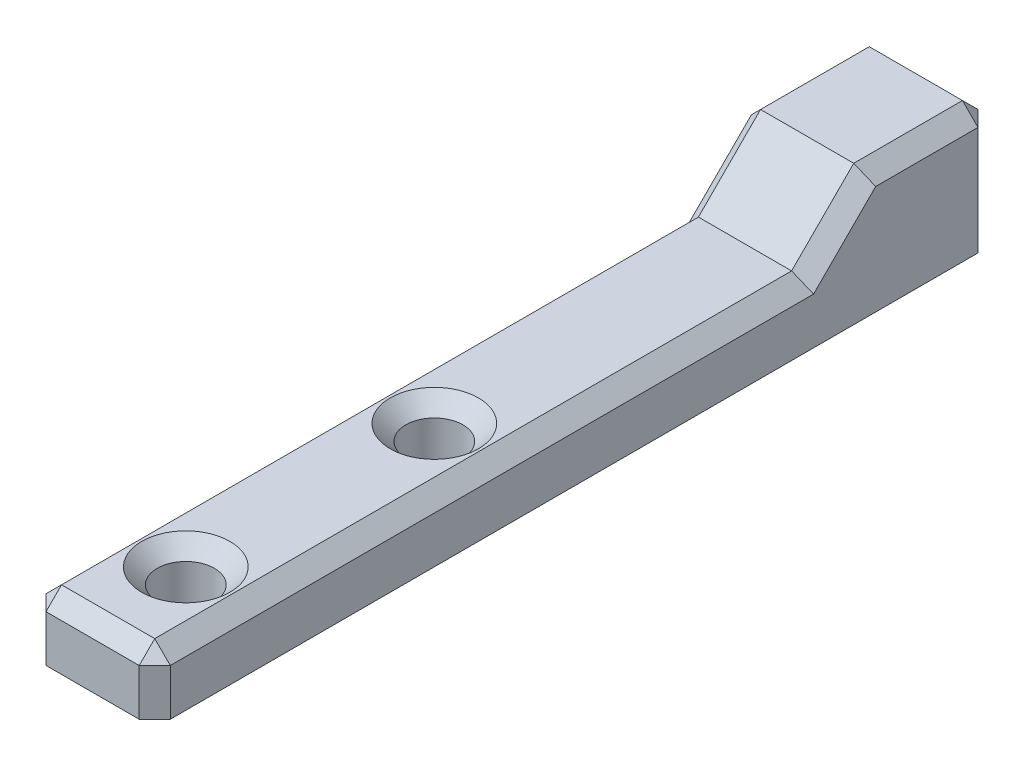
ISO-10303-21;
HEADER;
FILE_DESCRIPTION(('STEP AP214'),'2;1');
FILE_NAME('part.step','',(''),(''),'','','');
FILE_SCHEMA(('AUTOMOTIVE_DESIGN { 1 0 10303 214 1 1 1 1 }'));
ENDSEC;
DATA;
#1=APPLICATION_CONTEXT('core data for automotive mechanical design processes');
#2=APPLICATION_PROTOCOL_DEFINITION('international standard','automotive_design',2000,#1);
#3=PRODUCT_CONTEXT('',#1,'mechanical');
#4=PRODUCT('Part','Part','',(#3));
#5=PRODUCT_RELATED_PRODUCT_CATEGORY('part','',(#4));
#6=PRODUCT_DEFINITION_FORMATION('','',#4);
#7=PRODUCT_DEFINITION_CONTEXT('part definition',#1,'design');
#8=PRODUCT_DEFINITION('design','',#6,#7);
#9=PRODUCT_DEFINITION_SHAPE('','',#8);
#10=(LENGTH_UNIT() NAMED_UNIT(*) SI_UNIT(.MILLI.,.METRE.));
#11=(NAMED_UNIT(*) PLANE_ANGLE_UNIT() SI_UNIT($,.RADIAN.));
#12=(NAMED_UNIT(*) SI_UNIT($,.STERADIAN.) SOLID_ANGLE_UNIT());
#13=UNCERTAINTY_MEASURE_WITH_UNIT(LENGTH_MEASURE(1.E-05),#10,'distance_accuracy_value','');
#14=(GEOMETRIC_REPRESENTATION_CONTEXT(3) GLOBAL_UNCERTAINTY_ASSIGNED_CONTEXT((#13)) GLOBAL_UNIT_ASSIGNED_CONTEXT((#10,
#11,#12)) REPRESENTATION_CONTEXT('',''));
#15=CARTESIAN_POINT('',(0.,0.,0.));
#16=DIRECTION('',(0.,0.,1.));
#17=DIRECTION('',(1.,0.,0.));
#18=AXIS2_PLACEMENT_3D('',#15,#16,#17);
#19=CARTESIAN_POINT('',(0.,12.7,0.));
#20=DIRECTION('',(0.,-1.,0.));
#21=DIRECTION('',(0.,0.,-1.));
#22=AXIS2_PLACEMENT_3D('',#19,#20,#21);
#23=PLANE('',#22);
#24=DIRECTION('',(-1.,0.,0.));
#25=VECTOR('',#24,1.);
#26=CARTESIAN_POINT('',(0.,12.7,-84.1375));
#27=LINE('',#26,#25);
#28=CARTESIAN_POINT('',(11.1125,12.7,-84.1375));
#29=VERTEX_POINT('',#28);
#30=CARTESIAN_POINT('',(1.58750000000001,12.7,-84.1375));
#31=VERTEX_POINT('',#30);
#32=EDGE_CURVE('E251',#29,#31,#27,.T.);
#33=ORIENTED_EDGE('',*,*,#32,.T.);
#34=DIRECTION('',(0.,0.,1.));
#35=VECTOR('',#34,1.);
#36=CARTESIAN_POINT('',(1.58750000000001,12.7,0.));
#37=LINE('',#36,#35);
#38=CARTESIAN_POINT('',(1.58750000000001,12.7,-73.025));
#39=VERTEX_POINT('',#38);
#40=EDGE_CURVE('E254',#31,#39,#37,.T.);
#41=ORIENTED_EDGE('',*,*,#40,.T.);
#42=DIRECTION('',(1.,0.,0.));
#43=VECTOR('',#42,1.);
#44=CARTESIAN_POINT('',(0.,12.7,-73.025));
#45=LINE('',#44,#43);
#46=CARTESIAN_POINT('',(11.1125,12.7,-73.025));
#47=VERTEX_POINT('',#46);
#48=EDGE_CURVE('E338',#39,#47,#45,.T.);
#49=ORIENTED_EDGE('',*,*,#48,.T.);
#50=DIRECTION('',(0.,0.,-1.));
#51=VECTOR('',#50,1.);
#52=CARTESIAN_POINT('',(11.1125,12.7,0.));
#53=LINE('',#52,#51);
#54=EDGE_CURVE('E248',#47,#29,#53,.T.);
#55=ORIENTED_EDGE('',*,*,#54,.T.);
#56=EDGE_LOOP('',(#33,#41,#49,#55));
#57=FACE_BOUND('',#56,.T.);
#58=ADVANCED_FACE('F41',(#57),#23,.F.);
#59=CARTESIAN_POINT('',(0.,0.,0.));
#60=DIRECTION('',(0.,-1.,0.));
#61=DIRECTION('',(0.,0.,-1.));
#62=AXIS2_PLACEMENT_3D('',#59,#60,#61);
#63=PLANE('',#62);
#64=CARTESIAN_POINT('',(6.35,0.,-9.525));
#65=DIRECTION('',(0.,1.,0.));
#66=DIRECTION('',(0.,0.,1.));
#67=AXIS2_PLACEMENT_3D('',#64,#65,#66);
#68=CIRCLE('',#67,2.921);
#69=CARTESIAN_POINT('',(6.35,0.,-6.604));
#70=VERTEX_POINT('',#69);
#71=EDGE_CURVE('E183',#70,#70,#68,.T.);
#72=ORIENTED_EDGE('',*,*,#71,.T.);
#73=EDGE_LOOP('',(#72));
#74=FACE_BOUND('',#73,.T.);
#75=DIRECTION('',(1.,0.,0.));
#76=VECTOR('',#75,1.);
#77=CARTESIAN_POINT('',(0.,0.,0.));
#78=LINE('',#77,#76);
#79=CARTESIAN_POINT('',(1.58750000000001,0.,0.));
#80=VERTEX_POINT('',#79);
#81=CARTESIAN_POINT('',(11.1125,0.,0.));
#82=VERTEX_POINT('',#81);
#83=EDGE_CURVE('E161',#80,#82,#78,.T.);
#84=ORIENTED_EDGE('',*,*,#83,.F.);
#85=DIRECTION('',(0.707106781186548,0.,0.707106781186548));
#86=VECTOR('',#85,1.);
#87=CARTESIAN_POINT('',(0.793750000000003,0.,-0.793750000000003));
#88=LINE('',#87,#86);
#89=CARTESIAN_POINT('',(0.,0.,-1.58750000000001));
#90=VERTEX_POINT('',#89);
#91=EDGE_CURVE('E144',#80,#90,#88,.F.);
#92=ORIENTED_EDGE('',*,*,#91,.T.);
#93=DIRECTION('',(0.,0.,1.));
#94=VECTOR('',#93,1.);
#95=CARTESIAN_POINT('',(0.,0.,0.));
#96=LINE('',#95,#94);
#97=CARTESIAN_POINT('',(0.,0.,-84.1375));
#98=VERTEX_POINT('',#97);
#99=EDGE_CURVE('E176',#98,#90,#96,.T.);
#100=ORIENTED_EDGE('',*,*,#99,.F.);
#101=DIRECTION('',(-0.707106781186548,0.,0.707106781186548));
#102=VECTOR('',#101,1.);
#103=CARTESIAN_POINT('',(-42.06875,0.,-42.06875));
#104=LINE('',#103,#102);
#105=CARTESIAN_POINT('',(1.58750000000001,0.,-85.725));
#106=VERTEX_POINT('',#105);
#107=EDGE_CURVE('E199',#98,#106,#104,.F.);
#108=ORIENTED_EDGE('',*,*,#107,.T.);
#109=DIRECTION('',(-1.,0.,0.));
#110=VECTOR('',#109,1.);
#111=CARTESIAN_POINT('',(0.,0.,-85.725));
#112=LINE('',#111,#110);
#113=CARTESIAN_POINT('',(11.1125,0.,-85.725));
#114=VERTEX_POINT('',#113);
#115=EDGE_CURVE('E181',#114,#106,#112,.T.);
#116=ORIENTED_EDGE('',*,*,#115,.F.);
#117=DIRECTION('',(-0.707106781186548,0.,-0.707106781186548));
#118=VECTOR('',#117,1.);
#119=CARTESIAN_POINT('',(48.41875,0.,-48.41875));
#120=LINE('',#119,#118);
#121=CARTESIAN_POINT('',(12.7,0.,-84.1375));
#122=VERTEX_POINT('',#121);
#123=EDGE_CURVE('E167',#114,#122,#120,.F.);
#124=ORIENTED_EDGE('',*,*,#123,.T.);
#125=DIRECTION('',(0.,0.,-1.));
#126=VECTOR('',#125,1.);
#127=CARTESIAN_POINT('',(12.7,0.,0.));
#128=LINE('',#127,#126);
#129=CARTESIAN_POINT('',(12.7,0.,-1.58750000000001));
#130=VERTEX_POINT('',#129);
#131=EDGE_CURVE('E175',#130,#122,#128,.T.);
#132=ORIENTED_EDGE('',*,*,#131,.F.);
#133=DIRECTION('',(0.707106781186548,0.,-0.707106781186548));
#134=VECTOR('',#133,1.);
#135=CARTESIAN_POINT('',(5.55625,0.,5.55625));
#136=LINE('',#135,#134);
#137=EDGE_CURVE('E156',#130,#82,#136,.F.);
#138=ORIENTED_EDGE('',*,*,#137,.T.);
#139=EDGE_LOOP('',(#84,#92,#100,#108,#116,#124,#132,#138));
#140=FACE_BOUND('',#139,.T.);
#141=CARTESIAN_POINT('',(6.35,0.,-34.925));
#142=DIRECTION('',(0.,1.,0.));
#143=DIRECTION('',(0.,0.,1.));
#144=AXIS2_PLACEMENT_3D('',#141,#142,#143);
#145=CIRCLE('',#144,2.921);
#146=CARTESIAN_POINT('',(6.35,0.,-32.004));
#147=VERTEX_POINT('',#146);
#148=EDGE_CURVE('E344',#147,#147,#145,.T.);
#149=ORIENTED_EDGE('',*,*,#148,.T.);
#150=EDGE_LOOP('',(#149));
#151=FACE_BOUND('',#150,.T.);
#152=ADVANCED_FACE('F170',(#74,#140,#151),#63,.T.);
#153=CARTESIAN_POINT('',(0.,12.7,0.));
#154=DIRECTION('',(1.,0.,0.));
#155=DIRECTION('',(0.,0.,-1.));
#156=AXIS2_PLACEMENT_3D('',#153,#154,#155);
#157=PLANE('',#156);
#158=DIRECTION('',(0.,0.,-1.));
#159=VECTOR('',#158,1.);
#160=CARTESIAN_POINT('',(0.,11.1125,0.));
#161=LINE('',#160,#159);
#162=CARTESIAN_POINT('',(0.,11.1125,-73.6825640302673));
#163=VERTEX_POINT('',#162);
#164=CARTESIAN_POINT('',(0.,11.1125,-84.1375));
#165=VERTEX_POINT('',#164);
#166=EDGE_CURVE('E211',#163,#165,#161,.T.);
#167=ORIENTED_EDGE('',*,*,#166,.T.);
#168=DIRECTION('',(0.,-1.,0.));
#169=VECTOR('',#168,1.);
#170=CARTESIAN_POINT('',(0.,12.7,-84.1375));
#171=LINE('',#170,#169);
#172=EDGE_CURVE('E214',#165,#98,#171,.T.);
#173=ORIENTED_EDGE('',*,*,#172,.T.);
#174=ORIENTED_EDGE('',*,*,#99,.T.);
#175=DIRECTION('',(0.,1.,0.));
#176=VECTOR('',#175,1.);
#177=CARTESIAN_POINT('',(0.,12.7,-1.58750000000001));
#178=LINE('',#177,#176);
#179=CARTESIAN_POINT('',(0.,4.76249999999999,-1.58750000000001));
#180=VERTEX_POINT('',#179);
#181=EDGE_CURVE('E149',#90,#180,#178,.T.);
#182=ORIENTED_EDGE('',*,*,#181,.T.);
#183=DIRECTION('',(0.,0.,-1.));
#184=VECTOR('',#183,1.);
#185=CARTESIAN_POINT('',(0.,4.76249999999999,0.));
#186=LINE('',#185,#184);
#187=CARTESIAN_POINT('',(0.,4.76249999999999,-67.3325640302673));
#188=VERTEX_POINT('',#187);
#189=EDGE_CURVE('E155',#180,#188,#186,.T.);
#190=ORIENTED_EDGE('',*,*,#189,.T.);
#191=DIRECTION('',(0.,0.707106781186549,-0.707106781186546));
#192=VECTOR('',#191,1.);
#193=CARTESIAN_POINT('',(0.,-24.9350320151336,-37.6350320151338));
#194=LINE('',#193,#192);
#195=EDGE_CURVE('E206',#188,#163,#194,.T.);
#196=ORIENTED_EDGE('',*,*,#195,.T.);
#197=EDGE_LOOP('',(#167,#173,#174,#182,#190,#196));
#198=FACE_BOUND('',#197,.T.);
#199=ADVANCED_FACE('F378',(#198),#157,.F.);
#200=CARTESIAN_POINT('',(0.,12.7,0.));
#201=DIRECTION('',(0.,0.,-1.));
#202=DIRECTION('',(-1.,0.,0.));
#203=AXIS2_PLACEMENT_3D('',#200,#201,#202);
#204=PLANE('',#203);
#205=DIRECTION('',(-1.,0.,0.));
#206=VECTOR('',#205,1.);
#207=CARTESIAN_POINT('',(0.,4.76249999999999,0.));
#208=LINE('',#207,#206);
#209=CARTESIAN_POINT('',(11.1125,4.76249999999999,0.));
#210=VERTEX_POINT('',#209);
#211=CARTESIAN_POINT('',(1.58750000000001,4.76249999999999,0.));
#212=VERTEX_POINT('',#211);
#213=EDGE_CURVE('E164',#210,#212,#208,.T.);
#214=ORIENTED_EDGE('',*,*,#213,.T.);
#215=DIRECTION('',(0.,-1.,0.));
#216=VECTOR('',#215,1.);
#217=CARTESIAN_POINT('',(1.58750000000001,12.7,0.));
#218=LINE('',#217,#216);
#219=EDGE_CURVE('E148',#212,#80,#218,.T.);
#220=ORIENTED_EDGE('',*,*,#219,.T.);
#221=ORIENTED_EDGE('',*,*,#83,.T.);
#222=DIRECTION('',(0.,1.,0.));
#223=VECTOR('',#222,1.);
#224=CARTESIAN_POINT('',(11.1125,12.7,0.));
#225=LINE('',#224,#223);
#226=EDGE_CURVE('E168',#82,#210,#225,.T.);
#227=ORIENTED_EDGE('',*,*,#226,.T.);
#228=EDGE_LOOP('',(#214,#220,#221,#227));
#229=FACE_BOUND('',#228,.T.);
#230=ADVANCED_FACE('F160',(#229),#204,.F.);
#231=CARTESIAN_POINT('',(12.7,12.7,0.));
#232=DIRECTION('',(-1.,0.,0.));
#233=DIRECTION('',(0.,0.,1.));
#234=AXIS2_PLACEMENT_3D('',#231,#232,#233);
#235=PLANE('',#234);
#236=DIRECTION('',(0.,0.,1.));
#237=VECTOR('',#236,1.);
#238=CARTESIAN_POINT('',(12.7,4.76249999999999,0.));
#239=LINE('',#238,#237);
#240=CARTESIAN_POINT('',(12.7,4.76249999999999,-67.3325640302673));
#241=VERTEX_POINT('',#240);
#242=CARTESIAN_POINT('',(12.7,4.76249999999999,-1.58750000000001));
#243=VERTEX_POINT('',#242);
#244=EDGE_CURVE('E217',#241,#243,#239,.T.);
#245=ORIENTED_EDGE('',*,*,#244,.T.);
#246=DIRECTION('',(0.,-1.,0.));
#247=VECTOR('',#246,1.);
#248=CARTESIAN_POINT('',(12.7,12.7,-1.58750000000001));
#249=LINE('',#248,#247);
#250=EDGE_CURVE('E229',#243,#130,#249,.T.);
#251=ORIENTED_EDGE('',*,*,#250,.T.);
#252=ORIENTED_EDGE('',*,*,#131,.T.);
#253=DIRECTION('',(0.,1.,0.));
#254=VECTOR('',#253,1.);
#255=CARTESIAN_POINT('',(12.7,12.7,-84.1375));
#256=LINE('',#255,#254);
#257=CARTESIAN_POINT('',(12.7,11.1125,-84.1375));
#258=VERTEX_POINT('',#257);
#259=EDGE_CURVE('E226',#122,#258,#256,.T.);
#260=ORIENTED_EDGE('',*,*,#259,.T.);
#261=DIRECTION('',(0.,0.,1.));
#262=VECTOR('',#261,1.);
#263=CARTESIAN_POINT('',(12.7,11.1125,0.));
#264=LINE('',#263,#262);
#265=CARTESIAN_POINT('',(12.7,11.1125,-73.6825640302673));
#266=VERTEX_POINT('',#265);
#267=EDGE_CURVE('E223',#258,#266,#264,.T.);
#268=ORIENTED_EDGE('',*,*,#267,.T.);
#269=DIRECTION('',(0.,-0.707106781186549,0.707106781186546));
#270=VECTOR('',#269,1.);
#271=CARTESIAN_POINT('',(12.7,-24.9350320151336,-37.6350320151338));
#272=LINE('',#271,#270);
#273=EDGE_CURVE('E220',#266,#241,#272,.T.);
#274=ORIENTED_EDGE('',*,*,#273,.T.);
#275=EDGE_LOOP('',(#245,#251,#252,#260,#268,#274));
#276=FACE_BOUND('',#275,.T.);
#277=ADVANCED_FACE('F370',(#276),#235,.F.);
#278=CARTESIAN_POINT('',(0.,12.7,-85.725));
#279=DIRECTION('',(0.,0.,1.));
#280=DIRECTION('',(1.,0.,0.));
#281=AXIS2_PLACEMENT_3D('',#278,#279,#280);
#282=PLANE('',#281);
#283=ORIENTED_EDGE('',*,*,#115,.T.);
#284=DIRECTION('',(0.,1.,0.));
#285=VECTOR('',#284,1.);
#286=CARTESIAN_POINT('',(1.58750000000001,12.7,-85.725));
#287=LINE('',#286,#285);
#288=CARTESIAN_POINT('',(1.58750000000001,11.1125,-85.725));
#289=VERTEX_POINT('',#288);
#290=EDGE_CURVE('E238',#106,#289,#287,.T.);
#291=ORIENTED_EDGE('',*,*,#290,.T.);
#292=DIRECTION('',(1.,0.,0.));
#293=VECTOR('',#292,1.);
#294=CARTESIAN_POINT('',(0.,11.1125,-85.725));
#295=LINE('',#294,#293);
#296=CARTESIAN_POINT('',(11.1125,11.1125,-85.725));
#297=VERTEX_POINT('',#296);
#298=EDGE_CURVE('E232',#289,#297,#295,.T.);
#299=ORIENTED_EDGE('',*,*,#298,.T.);
#300=DIRECTION('',(0.,-1.,0.));
#301=VECTOR('',#300,1.);
#302=CARTESIAN_POINT('',(11.1125,12.7,-85.725));
#303=LINE('',#302,#301);
#304=EDGE_CURVE('E235',#297,#114,#303,.T.);
#305=ORIENTED_EDGE('',*,*,#304,.T.);
#306=EDGE_LOOP('',(#283,#291,#299,#305));
#307=FACE_BOUND('',#306,.T.);
#308=ADVANCED_FACE('F360',(#307),#282,.F.);
#309=CARTESIAN_POINT('',(6.35,12.7,-9.525));
#310=DIRECTION('',(0.,-1.,0.));
#311=DIRECTION('',(0.,0.,-1.));
#312=AXIS2_PLACEMENT_3D('',#309,#310,#311);
#313=CYLINDRICAL_SURFACE('',#312,2.921);
#314=CARTESIAN_POINT('',(6.35,4.76249999999999,-9.525));
#315=DIRECTION('',(0.,-1.,0.));
#316=DIRECTION('',(0.,0.,-1.));
#317=AXIS2_PLACEMENT_3D('',#314,#315,#316);
#318=CIRCLE('',#317,2.921);
#319=CARTESIAN_POINT('',(6.35,4.76249999999999,-12.446));
#320=VERTEX_POINT('',#319);
#321=EDGE_CURVE('E52',#320,#320,#318,.F.);
#322=ORIENTED_EDGE('',*,*,#321,.T.);
#323=EDGE_LOOP('',(#322));
#324=FACE_BOUND('',#323,.T.);
#325=ORIENTED_EDGE('',*,*,#71,.F.);
#326=EDGE_LOOP('',(#325));
#327=FACE_BOUND('',#326,.T.);
#328=ADVANCED_FACE('F357',(#324,#327),#313,.F.);
#329=CARTESIAN_POINT('',(6.35,12.7,-34.925));
#330=DIRECTION('',(0.,-1.,0.));
#331=DIRECTION('',(0.,0.,-1.));
#332=AXIS2_PLACEMENT_3D('',#329,#330,#331);
#333=CYLINDRICAL_SURFACE('',#332,2.921);
#334=CARTESIAN_POINT('',(6.35,4.7625,-34.925));
#335=DIRECTION('',(0.,-1.,0.));
#336=DIRECTION('',(0.,0.,-1.));
#337=AXIS2_PLACEMENT_3D('',#334,#335,#336);
#338=CIRCLE('',#337,2.921);
#339=CARTESIAN_POINT('',(6.35,4.7625,-37.846));
#340=VERTEX_POINT('',#339);
#341=EDGE_CURVE('E11',#340,#340,#338,.F.);
#342=ORIENTED_EDGE('',*,*,#341,.T.);
#343=EDGE_LOOP('',(#342));
#344=FACE_BOUND('',#343,.T.);
#345=ORIENTED_EDGE('',*,*,#148,.F.);
#346=EDGE_LOOP('',(#345));
#347=FACE_BOUND('',#346,.T.);
#348=ADVANCED_FACE('F359',(#344,#347),#333,.F.);
#349=CARTESIAN_POINT('',(0.,6.35,0.));
#350=DIRECTION('',(0.,-1.,0.));
#351=DIRECTION('',(0.,0.,-1.));
#352=AXIS2_PLACEMENT_3D('',#349,#350,#351);
#353=PLANE('',#352);
#354=CARTESIAN_POINT('',(6.35,6.35,-9.525));
#355=DIRECTION('',(0.,-1.,0.));
#356=DIRECTION('',(0.,0.,-1.));
#357=AXIS2_PLACEMENT_3D('',#354,#355,#356);
#358=CIRCLE('',#357,4.50850000000001);
#359=CARTESIAN_POINT('',(6.35,6.35,-14.0335));
#360=VERTEX_POINT('',#359);
#361=EDGE_CURVE('E261',#360,#360,#358,.T.);
#362=ORIENTED_EDGE('',*,*,#361,.T.);
#363=EDGE_LOOP('',(#362));
#364=FACE_BOUND('',#363,.T.);
#365=CARTESIAN_POINT('',(6.35,6.35,-34.925));
#366=DIRECTION('',(0.,-1.,0.));
#367=DIRECTION('',(0.,0.,-1.));
#368=AXIS2_PLACEMENT_3D('',#365,#366,#367);
#369=CIRCLE('',#368,4.5085);
#370=CARTESIAN_POINT('',(6.35,6.35,-39.4335));
#371=VERTEX_POINT('',#370);
#372=EDGE_CURVE('E257',#371,#371,#369,.T.);
#373=ORIENTED_EDGE('',*,*,#372,.T.);
#374=EDGE_LOOP('',(#373));
#375=FACE_BOUND('',#374,.T.);
#376=DIRECTION('',(-1.,0.,0.));
#377=VECTOR('',#376,1.);
#378=CARTESIAN_POINT('',(0.,6.35,-66.675));
#379=LINE('',#378,#377);
#380=CARTESIAN_POINT('',(11.1125,6.35,-66.675));
#381=VERTEX_POINT('',#380);
#382=CARTESIAN_POINT('',(1.58750000000001,6.35,-66.675));
#383=VERTEX_POINT('',#382);
#384=EDGE_CURVE('E190',#381,#383,#379,.T.);
#385=ORIENTED_EDGE('',*,*,#384,.T.);
#386=DIRECTION('',(0.,0.,1.));
#387=VECTOR('',#386,1.);
#388=CARTESIAN_POINT('',(1.58750000000001,6.35,0.));
#389=LINE('',#388,#387);
#390=CARTESIAN_POINT('',(1.58750000000001,6.35,-1.58750000000001));
#391=VERTEX_POINT('',#390);
#392=EDGE_CURVE('E60',#383,#391,#389,.T.);
#393=ORIENTED_EDGE('',*,*,#392,.T.);
#394=DIRECTION('',(1.,0.,0.));
#395=VECTOR('',#394,1.);
#396=CARTESIAN_POINT('',(0.,6.35,-1.58750000000001));
#397=LINE('',#396,#395);
#398=CARTESIAN_POINT('',(11.1125,6.35,-1.58750000000001));
#399=VERTEX_POINT('',#398);
#400=EDGE_CURVE('E64',#391,#399,#397,.T.);
#401=ORIENTED_EDGE('',*,*,#400,.T.);
#402=DIRECTION('',(0.,0.,-1.));
#403=VECTOR('',#402,1.);
#404=CARTESIAN_POINT('',(11.1125,6.35,0.));
#405=LINE('',#404,#403);
#406=EDGE_CURVE('E265',#399,#381,#405,.T.);
#407=ORIENTED_EDGE('',*,*,#406,.T.);
#408=EDGE_LOOP('',(#385,#393,#401,#407));
#409=FACE_BOUND('',#408,.T.);
#410=ADVANCED_FACE('F367',(#364,#375,#409),#353,.F.);
#411=CARTESIAN_POINT('',(0.,12.7,-73.025));
#412=DIRECTION('',(0.,0.707106781186546,0.707106781186549));
#413=DIRECTION('',(-1.,0.,0.));
#414=AXIS2_PLACEMENT_3D('',#411,#412,#413);
#415=PLANE('',#414);
#416=ORIENTED_EDGE('',*,*,#48,.F.);
#417=DIRECTION('',(0.,0.707106781186549,-0.707106781186546));
#418=VECTOR('',#417,1.);
#419=CARTESIAN_POINT('',(1.58750000000001,12.7,-73.025));
#420=LINE('',#419,#418);
#421=EDGE_CURVE('E244',#39,#383,#420,.F.);
#422=ORIENTED_EDGE('',*,*,#421,.T.);
#423=ORIENTED_EDGE('',*,*,#384,.F.);
#424=DIRECTION('',(0.,-0.707106781186549,0.707106781186546));
#425=VECTOR('',#424,1.);
#426=CARTESIAN_POINT('',(11.1125,12.7,-73.025));
#427=LINE('',#426,#425);
#428=EDGE_CURVE('E241',#381,#47,#427,.F.);
#429=ORIENTED_EDGE('',*,*,#428,.T.);
#430=EDGE_LOOP('',(#416,#422,#423,#429));
#431=FACE_BOUND('',#430,.T.);
#432=ADVANCED_FACE('F390',(#431),#415,.T.);
#433=CARTESIAN_POINT('',(11.1125,12.7,-85.725));
#434=DIRECTION('',(-0.707106781186548,0.,0.707106781186548));
#435=DIRECTION('',(0.,-1.,0.));
#436=AXIS2_PLACEMENT_3D('',#433,#434,#435);
#437=PLANE('',#436);
#438=DIRECTION('',(0.707106781186548,0.,0.707106781186548));
#439=VECTOR('',#438,1.);
#440=CARTESIAN_POINT('',(12.7,11.1125,-84.1375));
#441=LINE('',#440,#439);
#442=EDGE_CURVE('E46',#258,#297,#441,.F.);
#443=ORIENTED_EDGE('',*,*,#442,.F.);
#444=ORIENTED_EDGE('',*,*,#259,.F.);
#445=ORIENTED_EDGE('',*,*,#123,.F.);
#446=ORIENTED_EDGE('',*,*,#304,.F.);
#447=EDGE_LOOP('',(#443,#444,#445,#446));
#448=FACE_BOUND('',#447,.T.);
#449=ADVANCED_FACE('F396',(#448),#437,.F.);
#450=CARTESIAN_POINT('',(12.7,11.1125,-84.1375));
#451=DIRECTION('',(0.577350269189626,0.577350269189626,-0.577350269189626));
#452=DIRECTION('',(-0.707106781186547,0.,-0.707106781186547));
#453=AXIS2_PLACEMENT_3D('',#450,#451,#452);
#454=PLANE('',#453);
#455=DIRECTION('',(-0.707106781186548,0.707106781186548,0.));
#456=VECTOR('',#455,1.);
#457=CARTESIAN_POINT('',(12.7,11.1125,-84.1375));
#458=LINE('',#457,#456);
#459=EDGE_CURVE('E326',#258,#29,#458,.T.);
#460=ORIENTED_EDGE('',*,*,#459,.F.);
#461=ORIENTED_EDGE('',*,*,#442,.T.);
#462=DIRECTION('',(0.,-0.707106781186548,-0.707106781186548));
#463=VECTOR('',#462,1.);
#464=CARTESIAN_POINT('',(11.1125,11.90625,-84.93125));
#465=LINE('',#464,#463);
#466=EDGE_CURVE('E329',#29,#297,#465,.T.);
#467=ORIENTED_EDGE('',*,*,#466,.F.);
#468=EDGE_LOOP('',(#460,#461,#467));
#469=FACE_BOUND('',#468,.T.);
#470=ADVANCED_FACE('F495',(#469),#454,.T.);
#471=CARTESIAN_POINT('',(0.,12.7,-84.1375));
#472=DIRECTION('',(0.707106781186548,0.,0.707106781186548));
#473=DIRECTION('',(0.,-1.,0.));
#474=AXIS2_PLACEMENT_3D('',#471,#472,#473);
#475=PLANE('',#474);
#476=ORIENTED_EDGE('',*,*,#107,.F.);
#477=ORIENTED_EDGE('',*,*,#172,.F.);
#478=DIRECTION('',(0.707106781186548,0.,-0.707106781186548));
#479=VECTOR('',#478,1.);
#480=CARTESIAN_POINT('',(1.58750000000001,11.1125,-85.725));
#481=LINE('',#480,#479);
#482=EDGE_CURVE('E322',#289,#165,#481,.F.);
#483=ORIENTED_EDGE('',*,*,#482,.F.);
#484=ORIENTED_EDGE('',*,*,#290,.F.);
#485=EDGE_LOOP('',(#476,#477,#483,#484));
#486=FACE_BOUND('',#485,.T.);
#487=ADVANCED_FACE('F489',(#486),#475,.F.);
#488=CARTESIAN_POINT('',(0.,12.7,-84.1375));
#489=DIRECTION('',(0.,-0.707106781186548,0.707106781186548));
#490=DIRECTION('',(-1.,0.,0.));
#491=AXIS2_PLACEMENT_3D('',#488,#489,#490);
#492=PLANE('',#491);
#493=ORIENTED_EDGE('',*,*,#466,.T.);
#494=ORIENTED_EDGE('',*,*,#298,.F.);
#495=DIRECTION('',(0.,0.707106781186548,0.707106781186548));
#496=VECTOR('',#495,1.);
#497=CARTESIAN_POINT('',(1.58750000000001,11.1125,-85.725));
#498=LINE('',#497,#496);
#499=EDGE_CURVE('E318',#31,#289,#498,.F.);
#500=ORIENTED_EDGE('',*,*,#499,.F.);
#501=ORIENTED_EDGE('',*,*,#32,.F.);
#502=EDGE_LOOP('',(#493,#494,#500,#501));
#503=FACE_BOUND('',#502,.T.);
#504=ADVANCED_FACE('F482',(#503),#492,.F.);
#505=CARTESIAN_POINT('',(11.1125,12.7,0.));
#506=DIRECTION('',(-0.707106781186548,-0.707106781186548,0.));
#507=DIRECTION('',(0.,0.,-1.));
#508=AXIS2_PLACEMENT_3D('',#505,#506,#507);
#509=PLANE('',#508);
#510=ORIENTED_EDGE('',*,*,#459,.T.);
#511=ORIENTED_EDGE('',*,*,#54,.F.);
#512=DIRECTION('',(0.678598344545846,-0.678598344545847,-0.281084637714823));
#513=VECTOR('',#512,1.);
#514=CARTESIAN_POINT('',(22.4238990249953,1.38860097500468,-77.7103348855669));
#515=LINE('',#514,#513);
#516=EDGE_CURVE('E314',#266,#47,#515,.F.);
#517=ORIENTED_EDGE('',*,*,#516,.F.);
#518=ORIENTED_EDGE('',*,*,#267,.F.);
#519=EDGE_LOOP('',(#510,#511,#517,#518));
#520=FACE_BOUND('',#519,.T.);
#521=ADVANCED_FACE('F475',(#520),#509,.F.);
#522=CARTESIAN_POINT('',(1.58750000000001,11.1125,-85.725));
#523=DIRECTION('',(-0.577350269189626,0.577350269189626,-0.577350269189626));
#524=DIRECTION('',(-0.707106781186547,-0.707106781186547,0.));
#525=AXIS2_PLACEMENT_3D('',#522,#523,#524);
#526=PLANE('',#525);
#527=ORIENTED_EDGE('',*,*,#499,.T.);
#528=ORIENTED_EDGE('',*,*,#482,.T.);
#529=DIRECTION('',(-0.707106781186547,-0.707106781186547,0.));
#530=VECTOR('',#529,1.);
#531=CARTESIAN_POINT('',(0.793750000000003,11.90625,-84.1375));
#532=LINE('',#531,#530);
#533=EDGE_CURVE('E310',#31,#165,#532,.T.);
#534=ORIENTED_EDGE('',*,*,#533,.F.);
#535=EDGE_LOOP('',(#527,#528,#534));
#536=FACE_BOUND('',#535,.T.);
#537=ADVANCED_FACE('F468',(#536),#526,.T.);
#538=CARTESIAN_POINT('',(12.7,-24.9350320151336,-37.6350320151338));
#539=DIRECTION('',(0.707106781186548,0.499999999999998,0.500000000000001));
#540=DIRECTION('',(0.,0.707106781186549,-0.707106781186546));
#541=AXIS2_PLACEMENT_3D('',#538,#539,#540);
#542=PLANE('',#541);
#543=ORIENTED_EDGE('',*,*,#516,.T.);
#544=ORIENTED_EDGE('',*,*,#428,.F.);
#545=DIRECTION('',(0.678598344545846,-0.678598344545847,-0.281084637714823));
#546=VECTOR('',#545,1.);
#547=CARTESIAN_POINT('',(20.71097291447,-3.24847291446999,-70.6508176592444));
#548=LINE('',#547,#546);
#549=EDGE_CURVE('E306',#241,#381,#548,.F.);
#550=ORIENTED_EDGE('',*,*,#549,.F.);
#551=ORIENTED_EDGE('',*,*,#273,.F.);
#552=EDGE_LOOP('',(#543,#544,#550,#551));
#553=FACE_BOUND('',#552,.T.);
#554=ADVANCED_FACE('F461',(#553),#542,.T.);
#555=CARTESIAN_POINT('',(1.58750000000001,12.7,0.));
#556=DIRECTION('',(0.707106781186548,-0.707106781186548,0.));
#557=DIRECTION('',(0.,0.,1.));
#558=AXIS2_PLACEMENT_3D('',#555,#556,#557);
#559=PLANE('',#558);
#560=ORIENTED_EDGE('',*,*,#533,.T.);
#561=ORIENTED_EDGE('',*,*,#166,.F.);
#562=DIRECTION('',(-0.678598344545847,-0.678598344545846,-0.281084637714823));
#563=VECTOR('',#562,1.);
#564=CARTESIAN_POINT('',(15.5165491868758,26.6290491868758,-67.255398915834));
#565=LINE('',#564,#563);
#566=EDGE_CURVE('E302',#39,#163,#565,.T.);
#567=ORIENTED_EDGE('',*,*,#566,.F.);
#568=ORIENTED_EDGE('',*,*,#40,.F.);
#569=EDGE_LOOP('',(#560,#561,#567,#568));
#570=FACE_BOUND('',#569,.T.);
#571=ADVANCED_FACE('F454',(#570),#559,.F.);
#572=CARTESIAN_POINT('',(11.1125,6.35,0.));
#573=DIRECTION('',(-0.707106781186548,-0.707106781186548,0.));
#574=DIRECTION('',(0.,0.,-1.));
#575=AXIS2_PLACEMENT_3D('',#572,#573,#574);
#576=PLANE('',#575);
#577=ORIENTED_EDGE('',*,*,#549,.T.);
#578=ORIENTED_EDGE('',*,*,#406,.F.);
#579=DIRECTION('',(0.707106781186548,-0.707106781186548,0.));
#580=VECTOR('',#579,1.);
#581=CARTESIAN_POINT('',(11.90625,5.55625,-1.58750000000001));
#582=LINE('',#581,#580);
#583=EDGE_CURVE('E298',#243,#399,#582,.F.);
#584=ORIENTED_EDGE('',*,*,#583,.F.);
#585=ORIENTED_EDGE('',*,*,#244,.F.);
#586=EDGE_LOOP('',(#577,#578,#584,#585));
#587=FACE_BOUND('',#586,.T.);
#588=ADVANCED_FACE('F447',(#587),#576,.F.);
#589=CARTESIAN_POINT('',(12.7,12.7,-1.58750000000001));
#590=DIRECTION('',(-0.707106781186548,0.,-0.707106781186548));
#591=DIRECTION('',(0.,-1.,0.));
#592=AXIS2_PLACEMENT_3D('',#589,#590,#591);
#593=PLANE('',#592);
#594=ORIENTED_EDGE('',*,*,#137,.F.);
#595=ORIENTED_EDGE('',*,*,#250,.F.);
#596=DIRECTION('',(-0.707106781186548,0.,0.707106781186548));
#597=VECTOR('',#596,1.);
#598=CARTESIAN_POINT('',(11.1125,4.76249999999999,0.));
#599=LINE('',#598,#597);
#600=EDGE_CURVE('E294',#210,#243,#599,.F.);
#601=ORIENTED_EDGE('',*,*,#600,.F.);
#602=ORIENTED_EDGE('',*,*,#226,.F.);
#603=EDGE_LOOP('',(#594,#595,#601,#602));
#604=FACE_BOUND('',#603,.T.);
#605=ADVANCED_FACE('F440',(#604),#593,.F.);
#606=CARTESIAN_POINT('',(0.,-24.9350320151336,-37.6350320151338));
#607=DIRECTION('',(-0.707106781186548,0.499999999999998,0.500000000000001));
#608=DIRECTION('',(0.,-0.707106781186549,0.707106781186546));
#609=AXIS2_PLACEMENT_3D('',#606,#607,#608);
#610=PLANE('',#609);
#611=ORIENTED_EDGE('',*,*,#566,.T.);
#612=ORIENTED_EDGE('',*,*,#195,.F.);
#613=DIRECTION('',(0.678598344545846,0.678598344545847,0.281084637714823));
#614=VECTOR('',#613,1.);
#615=CARTESIAN_POINT('',(-8.01097291446999,-3.24847291446999,-70.6508176592444));
#616=LINE('',#615,#614);
#617=EDGE_CURVE('E290',#383,#188,#616,.F.);
#618=ORIENTED_EDGE('',*,*,#617,.F.);
#619=ORIENTED_EDGE('',*,*,#421,.F.);
#620=EDGE_LOOP('',(#611,#612,#618,#619));
#621=FACE_BOUND('',#620,.T.);
#622=ADVANCED_FACE('F433',(#621),#610,.T.);
#623=CARTESIAN_POINT('',(11.1125,4.76249999999999,0.));
#624=DIRECTION('',(0.577350269189626,0.577350269189626,0.577350269189626));
#625=DIRECTION('',(0.707106781186547,0.,-0.707106781186547));
#626=AXIS2_PLACEMENT_3D('',#623,#624,#625);
#627=PLANE('',#626);
#628=ORIENTED_EDGE('',*,*,#600,.T.);
#629=ORIENTED_EDGE('',*,*,#583,.T.);
#630=DIRECTION('',(0.,0.707106781186548,-0.707106781186548));
#631=VECTOR('',#630,1.);
#632=CARTESIAN_POINT('',(11.1125,4.76249999999999,0.));
#633=LINE('',#632,#631);
#634=EDGE_CURVE('E286',#210,#399,#633,.T.);
#635=ORIENTED_EDGE('',*,*,#634,.F.);
#636=EDGE_LOOP('',(#628,#629,#635));
#637=FACE_BOUND('',#636,.T.);
#638=ADVANCED_FACE('F426',(#637),#627,.T.);
#639=CARTESIAN_POINT('',(0.,4.76249999999999,0.));
#640=DIRECTION('',(0.707106781186548,-0.707106781186548,0.));
#641=DIRECTION('',(0.,0.,-1.));
#642=AXIS2_PLACEMENT_3D('',#639,#640,#641);
#643=PLANE('',#642);
#644=ORIENTED_EDGE('',*,*,#617,.T.);
#645=ORIENTED_EDGE('',*,*,#189,.F.);
#646=DIRECTION('',(0.707106781186547,0.707106781186547,0.));
#647=VECTOR('',#646,1.);
#648=CARTESIAN_POINT('',(0.,4.76249999999999,-1.58750000000001));
#649=LINE('',#648,#647);
#650=EDGE_CURVE('E282',#391,#180,#649,.F.);
#651=ORIENTED_EDGE('',*,*,#650,.F.);
#652=ORIENTED_EDGE('',*,*,#392,.F.);
#653=EDGE_LOOP('',(#644,#645,#651,#652));
#654=FACE_BOUND('',#653,.T.);
#655=ADVANCED_FACE('F419',(#654),#643,.F.);
#656=CARTESIAN_POINT('',(0.,6.35,-1.58750000000001));
#657=DIRECTION('',(0.,-0.707106781186548,-0.707106781186548));
#658=DIRECTION('',(1.,0.,0.));
#659=AXIS2_PLACEMENT_3D('',#656,#657,#658);
#660=PLANE('',#659);
#661=ORIENTED_EDGE('',*,*,#634,.T.);
#662=ORIENTED_EDGE('',*,*,#400,.F.);
#663=DIRECTION('',(0.,-0.707106781186548,0.707106781186548));
#664=VECTOR('',#663,1.);
#665=CARTESIAN_POINT('',(1.58750000000001,5.55625,-0.793750000000003));
#666=LINE('',#665,#664);
#667=EDGE_CURVE('E278',#212,#391,#666,.F.);
#668=ORIENTED_EDGE('',*,*,#667,.F.);
#669=ORIENTED_EDGE('',*,*,#213,.F.);
#670=EDGE_LOOP('',(#661,#662,#668,#669));
#671=FACE_BOUND('',#670,.T.);
#672=ADVANCED_FACE('F412',(#671),#660,.F.);
#673=CARTESIAN_POINT('',(0.,4.76249999999999,-1.58750000000001));
#674=DIRECTION('',(-0.577350269189626,0.577350269189626,0.577350269189626));
#675=DIRECTION('',(0.707106781186548,0.,0.707106781186547));
#676=AXIS2_PLACEMENT_3D('',#673,#674,#675);
#677=PLANE('',#676);
#678=ORIENTED_EDGE('',*,*,#667,.T.);
#679=ORIENTED_EDGE('',*,*,#650,.T.);
#680=DIRECTION('',(-0.707106781186548,0.,-0.707106781186548));
#681=VECTOR('',#680,1.);
#682=CARTESIAN_POINT('',(0.,4.76249999999999,-1.58750000000001));
#683=LINE('',#682,#681);
#684=EDGE_CURVE('E275',#212,#180,#683,.T.);
#685=ORIENTED_EDGE('',*,*,#684,.F.);
#686=EDGE_LOOP('',(#678,#679,#685));
#687=FACE_BOUND('',#686,.T.);
#688=ADVANCED_FACE('F406',(#687),#677,.T.);
#689=CARTESIAN_POINT('',(1.58750000000001,12.7,0.));
#690=DIRECTION('',(0.707106781186548,0.,-0.707106781186548));
#691=DIRECTION('',(0.,-1.,0.));
#692=AXIS2_PLACEMENT_3D('',#689,#690,#691);
#693=PLANE('',#692);
#694=ORIENTED_EDGE('',*,*,#684,.T.);
#695=ORIENTED_EDGE('',*,*,#181,.F.);
#696=ORIENTED_EDGE('',*,*,#91,.F.);
#697=ORIENTED_EDGE('',*,*,#219,.F.);
#698=EDGE_LOOP('',(#694,#695,#696,#697));
#699=FACE_BOUND('',#698,.T.);
#700=ADVANCED_FACE('F147',(#699),#693,.F.);
#701=CARTESIAN_POINT('',(6.35,6.35,-9.525));
#702=DIRECTION('',(0.,1.,0.));
#703=DIRECTION('',(0.,0.,1.));
#704=AXIS2_PLACEMENT_3D('',#701,#702,#703);
#705=CONICAL_SURFACE('',#704,4.50850000000001,0.785398163397447);
#706=ORIENTED_EDGE('',*,*,#321,.F.);
#707=EDGE_LOOP('',(#706));
#708=FACE_BOUND('',#707,.T.);
#709=ORIENTED_EDGE('',*,*,#361,.F.);
#710=EDGE_LOOP('',(#709));
#711=FACE_BOUND('',#710,.T.);
#712=ADVANCED_FACE('F405',(#708,#711),#705,.F.);
#713=CARTESIAN_POINT('',(6.35,6.35,-34.925));
#714=DIRECTION('',(0.,1.,0.));
#715=DIRECTION('',(0.,0.,1.));
#716=AXIS2_PLACEMENT_3D('',#713,#714,#715);
#717=CONICAL_SURFACE('',#716,4.5085,0.785398163397447);
#718=ORIENTED_EDGE('',*,*,#341,.F.);
#719=EDGE_LOOP('',(#718));
#720=FACE_BOUND('',#719,.T.);
#721=ORIENTED_EDGE('',*,*,#372,.F.);
#722=EDGE_LOOP('',(#721));
#723=FACE_BOUND('',#722,.T.);
#724=ADVANCED_FACE('F44',(#720,#723),#717,.F.);
#725=CLOSED_SHELL('',(#58,#152,#199,#230,#277,#308,#328,#348,#410,#432,#449,#470,#487,#504,#521,
#537,#554,#571,#588,#605,#622,#638,#655,#672,#688,#700,#712,#724));
#726=MANIFOLD_SOLID_BREP('B2',#725);
#727=ADVANCED_BREP_SHAPE_REPRESENTATION('',(#18,#726),#14);
#728=SHAPE_DEFINITION_REPRESENTATION(#9,#727);
ENDSEC;
END-ISO-10303-21;
